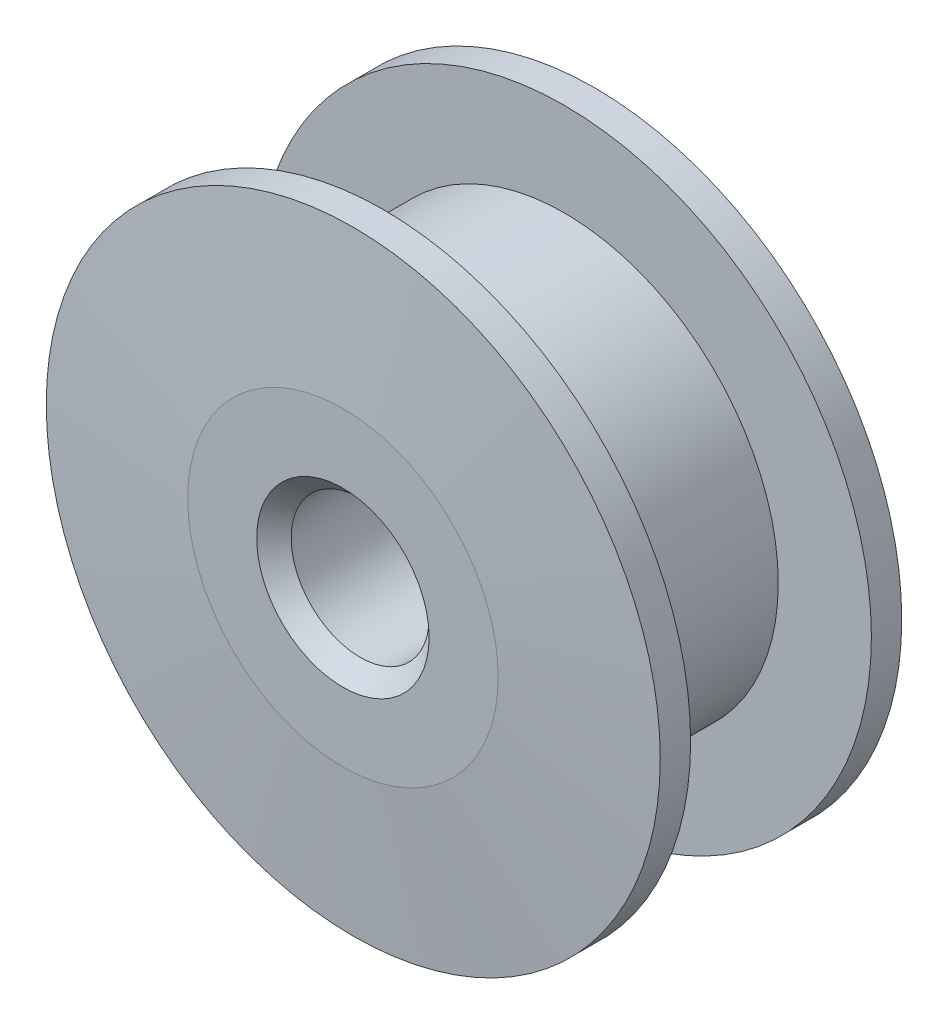
ISO-10303-21;
HEADER;
FILE_DESCRIPTION(('STEP AP214'),'2;1');
FILE_NAME('part.step','',(''),(''),'','','');
FILE_SCHEMA(('AUTOMOTIVE_DESIGN { 1 0 10303 214 1 1 1 1 }'));
ENDSEC;
DATA;
#1=APPLICATION_CONTEXT('core data for automotive mechanical design processes');
#2=APPLICATION_PROTOCOL_DEFINITION('international standard','automotive_design',2000,#1);
#3=PRODUCT_CONTEXT('',#1,'mechanical');
#4=PRODUCT('Part','Part','',(#3));
#5=PRODUCT_RELATED_PRODUCT_CATEGORY('part','',(#4));
#6=PRODUCT_DEFINITION_FORMATION('','',#4);
#7=PRODUCT_DEFINITION_CONTEXT('part definition',#1,'design');
#8=PRODUCT_DEFINITION('design','',#6,#7);
#9=PRODUCT_DEFINITION_SHAPE('','',#8);
#10=(LENGTH_UNIT() NAMED_UNIT(*) SI_UNIT(.MILLI.,.METRE.));
#11=(NAMED_UNIT(*) PLANE_ANGLE_UNIT() SI_UNIT($,.RADIAN.));
#12=(NAMED_UNIT(*) SI_UNIT($,.STERADIAN.) SOLID_ANGLE_UNIT());
#13=UNCERTAINTY_MEASURE_WITH_UNIT(LENGTH_MEASURE(1.E-05),#10,'distance_accuracy_value','');
#14=(GEOMETRIC_REPRESENTATION_CONTEXT(3) GLOBAL_UNCERTAINTY_ASSIGNED_CONTEXT((#13)) GLOBAL_UNIT_ASSIGNED_CONTEXT((#10,
#11,#12)) REPRESENTATION_CONTEXT('',''));
#15=CARTESIAN_POINT('',(0.,0.,0.));
#16=DIRECTION('',(0.,0.,1.));
#17=DIRECTION('',(1.,0.,0.));
#18=AXIS2_PLACEMENT_3D('',#15,#16,#17);
#19=CARTESIAN_POINT('',(0.,0.,1.9));
#20=DIRECTION('',(0.,0.,-1.));
#21=DIRECTION('',(-1.,0.,0.));
#22=AXIS2_PLACEMENT_3D('',#19,#20,#21);
#23=CYLINDRICAL_SURFACE('',#22,4.45);
#24=CARTESIAN_POINT('',(0.,0.,-1.75));
#25=DIRECTION('',(0.,0.,1.));
#26=DIRECTION('',(1.,0.,0.));
#27=AXIS2_PLACEMENT_3D('',#24,#25,#26);
#28=CIRCLE('',#27,4.45);
#29=CARTESIAN_POINT('',(-4.45,0.,-1.75));
#30=VERTEX_POINT('',#29);
#31=EDGE_CURVE('E47',#30,#30,#28,.T.);
#32=CARTESIAN_POINT('',(0.,0.,-1.31));
#33=DIRECTION('',(0.,0.,1.));
#34=DIRECTION('',(1.,0.,0.));
#35=AXIS2_PLACEMENT_3D('',#32,#33,#34);
#36=CIRCLE('',#35,4.45);
#37=CARTESIAN_POINT('',(-4.45,0.,-1.31));
#38=VERTEX_POINT('',#37);
#39=EDGE_CURVE('E64',#38,#38,#36,.T.);
#40=CARTESIAN_POINT('',(-4.45,0.,-1.75));
#41=CARTESIAN_POINT('',(-4.45,0.,-1.74541666666667));
#42=CARTESIAN_POINT('',(-4.45,0.,-1.74083333333333));
#43=CARTESIAN_POINT('',(-4.45,0.,-1.73166666666667));
#44=CARTESIAN_POINT('',(-4.45,0.,-1.72708333333333));
#45=CARTESIAN_POINT('',(-4.45,0.,-1.71791666666667));
#46=CARTESIAN_POINT('',(-4.45,0.,-1.71333333333333));
#47=CARTESIAN_POINT('',(-4.45,0.,-1.70416666666667));
#48=CARTESIAN_POINT('',(-4.45,0.,-1.69958333333333));
#49=CARTESIAN_POINT('',(-4.45,0.,-1.69041666666667));
#50=CARTESIAN_POINT('',(-4.45,0.,-1.68583333333333));
#51=CARTESIAN_POINT('',(-4.45,0.,-1.67666666666667));
#52=CARTESIAN_POINT('',(-4.45,0.,-1.67208333333333));
#53=CARTESIAN_POINT('',(-4.45,0.,-1.66291666666667));
#54=CARTESIAN_POINT('',(-4.45,0.,-1.65833333333333));
#55=CARTESIAN_POINT('',(-4.45,0.,-1.64916666666667));
#56=CARTESIAN_POINT('',(-4.45,0.,-1.64458333333333));
#57=CARTESIAN_POINT('',(-4.45,0.,-1.63541666666667));
#58=CARTESIAN_POINT('',(-4.45,0.,-1.63083333333333));
#59=CARTESIAN_POINT('',(-4.45,0.,-1.62166666666667));
#60=CARTESIAN_POINT('',(-4.45,0.,-1.61708333333333));
#61=CARTESIAN_POINT('',(-4.45,0.,-1.60791666666667));
#62=CARTESIAN_POINT('',(-4.45,0.,-1.60333333333333));
#63=CARTESIAN_POINT('',(-4.45,0.,-1.59416666666667));
#64=CARTESIAN_POINT('',(-4.45,0.,-1.58958333333333));
#65=CARTESIAN_POINT('',(-4.45,0.,-1.58041666666667));
#66=CARTESIAN_POINT('',(-4.45,0.,-1.57583333333333));
#67=CARTESIAN_POINT('',(-4.45,0.,-1.56666666666667));
#68=CARTESIAN_POINT('',(-4.45,0.,-1.56208333333333));
#69=CARTESIAN_POINT('',(-4.45,0.,-1.55291666666667));
#70=CARTESIAN_POINT('',(-4.45,0.,-1.54833333333333));
#71=CARTESIAN_POINT('',(-4.45,0.,-1.53916666666667));
#72=CARTESIAN_POINT('',(-4.45,0.,-1.53458333333333));
#73=CARTESIAN_POINT('',(-4.45,0.,-1.52541666666667));
#74=CARTESIAN_POINT('',(-4.45,0.,-1.52083333333333));
#75=CARTESIAN_POINT('',(-4.45,0.,-1.51166666666667));
#76=CARTESIAN_POINT('',(-4.45,0.,-1.50708333333333));
#77=CARTESIAN_POINT('',(-4.45,0.,-1.49791666666667));
#78=CARTESIAN_POINT('',(-4.45,0.,-1.49333333333333));
#79=CARTESIAN_POINT('',(-4.45,0.,-1.48416666666667));
#80=CARTESIAN_POINT('',(-4.45,0.,-1.47958333333333));
#81=CARTESIAN_POINT('',(-4.45,0.,-1.47041666666667));
#82=CARTESIAN_POINT('',(-4.45,0.,-1.46583333333333));
#83=CARTESIAN_POINT('',(-4.45,0.,-1.45666666666667));
#84=CARTESIAN_POINT('',(-4.45,0.,-1.45208333333333));
#85=CARTESIAN_POINT('',(-4.45,0.,-1.44291666666667));
#86=CARTESIAN_POINT('',(-4.45,0.,-1.43833333333333));
#87=CARTESIAN_POINT('',(-4.45,0.,-1.42916666666667));
#88=CARTESIAN_POINT('',(-4.45,0.,-1.42458333333333));
#89=CARTESIAN_POINT('',(-4.45,0.,-1.41541666666667));
#90=CARTESIAN_POINT('',(-4.45,0.,-1.41083333333333));
#91=CARTESIAN_POINT('',(-4.45,0.,-1.40166666666667));
#92=CARTESIAN_POINT('',(-4.45,0.,-1.39708333333333));
#93=CARTESIAN_POINT('',(-4.45,0.,-1.38791666666667));
#94=CARTESIAN_POINT('',(-4.45,0.,-1.38333333333333));
#95=CARTESIAN_POINT('',(-4.45,0.,-1.37416666666667));
#96=CARTESIAN_POINT('',(-4.45,0.,-1.36958333333333));
#97=CARTESIAN_POINT('',(-4.45,0.,-1.36041666666667));
#98=CARTESIAN_POINT('',(-4.45,0.,-1.35583333333333));
#99=CARTESIAN_POINT('',(-4.45,0.,-1.34666666666667));
#100=CARTESIAN_POINT('',(-4.45,0.,-1.34208333333333));
#101=CARTESIAN_POINT('',(-4.45,0.,-1.33291666666667));
#102=CARTESIAN_POINT('',(-4.45,0.,-1.32833333333333));
#103=CARTESIAN_POINT('',(-4.45,0.,-1.31916666666667));
#104=CARTESIAN_POINT('',(-4.45,0.,-1.31458333333333));
#105=CARTESIAN_POINT('',(-4.45,0.,-1.31));
#106=B_SPLINE_CURVE_WITH_KNOTS('',3,(#40,#41,#42,#43,#44,#45,#46,#47,#48,#49,#50,#51,#52,#53,
#54,#55,#56,#57,#58,#59,#60,#61,#62,#63,#64,#65,#66,#67,#68,#69,#70,#71,#72,#73,#74,#75,#76,#77,
#78,#79,#80,#81,#82,#83,#84,#85,#86,#87,#88,#89,#90,#91,#92,#93,#94,#95,#96,#97,#98,#99,#100,
#101,#102,#103,#104,#105),.UNSPECIFIED.,.F.,.F.,(4,2,2,2,2,2,2,2,2,2,2,2,2,2,2,2,2,2,2,2,2,2,2,
2,2,2,2,2,2,2,2,2,4),(0.,0.0137499999999999,0.0275000000000002,0.0412500000000001,
0.0549999999999999,0.0687500000000002,0.0825000000000001,0.09625,0.11,0.12375,0.1375,0.15125,
0.165,0.17875,0.1925,0.20625,0.22,0.23375,0.2475,0.26125,0.275,0.28875,0.3025,0.31625,0.33,
0.34375,0.3575,0.37125,0.385,0.39875,0.4125,0.42625,0.44),.UNSPECIFIED.);
#107=EDGE_CURVE('BSEAM32',#30,#38,#106,.T.);
#108=ORIENTED_EDGE('',*,*,#31,.T.);
#109=ORIENTED_EDGE('',*,*,#39,.F.);
#110=ORIENTED_EDGE('',*,*,#107,.T.);
#111=ORIENTED_EDGE('',*,*,#107,.F.);
#112=EDGE_LOOP('',(#108,#110,#109,#111));
#113=FACE_BOUND('',#112,.T.);
#114=ADVANCED_FACE('F32',(#113),#23,.T.);
#115=CARTESIAN_POINT('',(0.,0.,-1.9));
#116=DIRECTION('',(0.,0.,1.));
#117=DIRECTION('',(1.,0.,0.));
#118=AXIS2_PLACEMENT_3D('',#115,#116,#117);
#119=PLANE('',#118);
#120=CARTESIAN_POINT('',(0.,0.,-1.9));
#121=DIRECTION('',(0.,0.,1.));
#122=DIRECTION('',(1.,0.,0.));
#123=AXIS2_PLACEMENT_3D('',#120,#121,#122);
#124=CIRCLE('',#123,2.44999999999991);
#125=CARTESIAN_POINT('',(2.44999999999991,0.,-1.9));
#126=VERTEX_POINT('',#125);
#127=EDGE_CURVE('E43',#126,#126,#124,.F.);
#128=ORIENTED_EDGE('',*,*,#127,.T.);
#129=EDGE_LOOP('',(#128));
#130=FACE_BOUND('',#129,.T.);
#131=CARTESIAN_POINT('',(0.,0.,-1.9));
#132=DIRECTION('',(0.,0.,1.));
#133=DIRECTION('',(1.,0.,0.));
#134=AXIS2_PLACEMENT_3D('',#131,#132,#133);
#135=CIRCLE('',#134,1.25);
#136=CARTESIAN_POINT('',(1.25,0.,-1.9));
#137=VERTEX_POINT('',#136);
#138=EDGE_CURVE('E55',#137,#137,#135,.T.);
#139=ORIENTED_EDGE('',*,*,#138,.T.);
#140=EDGE_LOOP('',(#139));
#141=FACE_BOUND('',#140,.T.);
#142=ADVANCED_FACE('F84',(#130,#141),#119,.F.);
#143=CARTESIAN_POINT('',(0.,0.,-1.31));
#144=DIRECTION('',(0.,0.,1.));
#145=DIRECTION('',(1.,0.,0.));
#146=AXIS2_PLACEMENT_3D('',#143,#144,#145);
#147=PLANE('',#146);
#148=CARTESIAN_POINT('',(0.,0.,-1.31));
#149=DIRECTION('',(0.,0.,1.));
#150=DIRECTION('',(1.,0.,0.));
#151=AXIS2_PLACEMENT_3D('',#148,#149,#150);
#152=CIRCLE('',#151,3.1);
#153=CARTESIAN_POINT('',(3.1,0.,-1.31));
#154=VERTEX_POINT('',#153);
#155=EDGE_CURVE('E68',#154,#154,#152,.T.);
#156=ORIENTED_EDGE('',*,*,#155,.F.);
#157=EDGE_LOOP('',(#156));
#158=FACE_BOUND('',#157,.T.);
#159=ORIENTED_EDGE('',*,*,#39,.T.);
#160=EDGE_LOOP('',(#159));
#161=FACE_BOUND('',#160,.T.);
#162=ADVANCED_FACE('F80',(#158,#161),#147,.T.);
#163=CARTESIAN_POINT('',(0.,0.,1.31));
#164=DIRECTION('',(0.,0.,1.));
#165=DIRECTION('',(1.,0.,0.));
#166=AXIS2_PLACEMENT_3D('',#163,#164,#165);
#167=PLANE('',#166);
#168=CARTESIAN_POINT('',(0.,0.,1.31));
#169=DIRECTION('',(0.,0.,1.));
#170=DIRECTION('',(1.,0.,0.));
#171=AXIS2_PLACEMENT_3D('',#168,#169,#170);
#172=CIRCLE('',#171,3.1);
#173=CARTESIAN_POINT('',(3.1,0.,1.31));
#174=VERTEX_POINT('',#173);
#175=EDGE_CURVE('E71',#174,#174,#172,.T.);
#176=ORIENTED_EDGE('',*,*,#175,.T.);
#177=EDGE_LOOP('',(#176));
#178=FACE_BOUND('',#177,.T.);
#179=CARTESIAN_POINT('',(0.,0.,1.31));
#180=DIRECTION('',(0.,0.,1.));
#181=DIRECTION('',(1.,0.,0.));
#182=AXIS2_PLACEMENT_3D('',#179,#180,#181);
#183=CIRCLE('',#182,4.45);
#184=CARTESIAN_POINT('',(-4.45,0.,1.31));
#185=VERTEX_POINT('',#184);
#186=EDGE_CURVE('E65',#185,#185,#183,.T.);
#187=ORIENTED_EDGE('',*,*,#186,.F.);
#188=EDGE_LOOP('',(#187));
#189=FACE_BOUND('',#188,.T.);
#190=ADVANCED_FACE('F83',(#178,#189),#167,.F.);
#191=CARTESIAN_POINT('',(0.,0.,-1.31));
#192=DIRECTION('',(0.,0.,1.));
#193=DIRECTION('',(1.,0.,0.));
#194=AXIS2_PLACEMENT_3D('',#191,#192,#193);
#195=CYLINDRICAL_SURFACE('',#194,3.1);
#196=ORIENTED_EDGE('',*,*,#155,.T.);
#197=EDGE_LOOP('',(#196));
#198=FACE_BOUND('',#197,.T.);
#199=ORIENTED_EDGE('',*,*,#175,.F.);
#200=EDGE_LOOP('',(#199));
#201=FACE_BOUND('',#200,.T.);
#202=ADVANCED_FACE('F77',(#198,#201),#195,.T.);
#203=CARTESIAN_POINT('',(0.,0.,1.9));
#204=DIRECTION('',(0.,0.,1.));
#205=DIRECTION('',(1.,0.,0.));
#206=AXIS2_PLACEMENT_3D('',#203,#204,#205);
#207=PLANE('',#206);
#208=CARTESIAN_POINT('',(0.,0.,1.9));
#209=DIRECTION('',(0.,0.,1.));
#210=DIRECTION('',(1.,0.,0.));
#211=AXIS2_PLACEMENT_3D('',#208,#209,#210);
#212=CIRCLE('',#211,2.24999999999989);
#213=CARTESIAN_POINT('',(2.24999999999989,0.,1.9));
#214=VERTEX_POINT('',#213);
#215=EDGE_CURVE('E39',#214,#214,#212,.T.);
#216=ORIENTED_EDGE('',*,*,#215,.T.);
#217=EDGE_LOOP('',(#216));
#218=FACE_BOUND('',#217,.T.);
#219=CARTESIAN_POINT('',(0.,0.,1.9));
#220=DIRECTION('',(0.,0.,1.));
#221=DIRECTION('',(1.,0.,0.));
#222=AXIS2_PLACEMENT_3D('',#219,#220,#221);
#223=CIRCLE('',#222,1.25);
#224=CARTESIAN_POINT('',(1.25,0.,1.9));
#225=VERTEX_POINT('',#224);
#226=EDGE_CURVE('E52',#225,#225,#223,.F.);
#227=ORIENTED_EDGE('',*,*,#226,.T.);
#228=EDGE_LOOP('',(#227));
#229=FACE_BOUND('',#228,.T.);
#230=ADVANCED_FACE('F100',(#218,#229),#207,.T.);
#231=CARTESIAN_POINT('',(0.,0.,1.75));
#232=DIRECTION('',(0.,0.,1.));
#233=DIRECTION('',(1.,0.,0.));
#234=AXIS2_PLACEMENT_3D('',#231,#232,#233);
#235=CIRCLE('',#234,4.45);
#236=CARTESIAN_POINT('',(-4.45,0.,1.75));
#237=VERTEX_POINT('',#236);
#238=EDGE_CURVE('E10',#237,#237,#235,.F.);
#239=CARTESIAN_POINT('',(-4.45,0.,1.75));
#240=CARTESIAN_POINT('',(-4.45,0.,1.74541666666667));
#241=CARTESIAN_POINT('',(-4.45,0.,1.74083333333333));
#242=CARTESIAN_POINT('',(-4.45,0.,1.73166666666667));
#243=CARTESIAN_POINT('',(-4.45,0.,1.72708333333333));
#244=CARTESIAN_POINT('',(-4.45,0.,1.71791666666667));
#245=CARTESIAN_POINT('',(-4.45,0.,1.71333333333333));
#246=CARTESIAN_POINT('',(-4.45,0.,1.70416666666667));
#247=CARTESIAN_POINT('',(-4.45,0.,1.69958333333333));
#248=CARTESIAN_POINT('',(-4.45,0.,1.69041666666667));
#249=CARTESIAN_POINT('',(-4.45,0.,1.68583333333333));
#250=CARTESIAN_POINT('',(-4.45,0.,1.67666666666667));
#251=CARTESIAN_POINT('',(-4.45,0.,1.67208333333333));
#252=CARTESIAN_POINT('',(-4.45,0.,1.66291666666667));
#253=CARTESIAN_POINT('',(-4.45,0.,1.65833333333333));
#254=CARTESIAN_POINT('',(-4.45,0.,1.64916666666667));
#255=CARTESIAN_POINT('',(-4.45,0.,1.64458333333333));
#256=CARTESIAN_POINT('',(-4.45,0.,1.63541666666667));
#257=CARTESIAN_POINT('',(-4.45,0.,1.63083333333333));
#258=CARTESIAN_POINT('',(-4.45,0.,1.62166666666667));
#259=CARTESIAN_POINT('',(-4.45,0.,1.61708333333333));
#260=CARTESIAN_POINT('',(-4.45,0.,1.60791666666667));
#261=CARTESIAN_POINT('',(-4.45,0.,1.60333333333333));
#262=CARTESIAN_POINT('',(-4.45,0.,1.59416666666667));
#263=CARTESIAN_POINT('',(-4.45,0.,1.58958333333333));
#264=CARTESIAN_POINT('',(-4.45,0.,1.58041666666667));
#265=CARTESIAN_POINT('',(-4.45,0.,1.57583333333333));
#266=CARTESIAN_POINT('',(-4.45,0.,1.56666666666667));
#267=CARTESIAN_POINT('',(-4.45,0.,1.56208333333333));
#268=CARTESIAN_POINT('',(-4.45,0.,1.55291666666667));
#269=CARTESIAN_POINT('',(-4.45,0.,1.54833333333333));
#270=CARTESIAN_POINT('',(-4.45,0.,1.53916666666667));
#271=CARTESIAN_POINT('',(-4.45,0.,1.53458333333333));
#272=CARTESIAN_POINT('',(-4.45,0.,1.52541666666667));
#273=CARTESIAN_POINT('',(-4.45,0.,1.52083333333333));
#274=CARTESIAN_POINT('',(-4.45,0.,1.51166666666667));
#275=CARTESIAN_POINT('',(-4.45,0.,1.50708333333333));
#276=CARTESIAN_POINT('',(-4.45,0.,1.49791666666667));
#277=CARTESIAN_POINT('',(-4.45,0.,1.49333333333333));
#278=CARTESIAN_POINT('',(-4.45,0.,1.48416666666667));
#279=CARTESIAN_POINT('',(-4.45,0.,1.47958333333333));
#280=CARTESIAN_POINT('',(-4.45,0.,1.47041666666667));
#281=CARTESIAN_POINT('',(-4.45,0.,1.46583333333333));
#282=CARTESIAN_POINT('',(-4.45,0.,1.45666666666667));
#283=CARTESIAN_POINT('',(-4.45,0.,1.45208333333333));
#284=CARTESIAN_POINT('',(-4.45,0.,1.44291666666667));
#285=CARTESIAN_POINT('',(-4.45,0.,1.43833333333333));
#286=CARTESIAN_POINT('',(-4.45,0.,1.42916666666667));
#287=CARTESIAN_POINT('',(-4.45,0.,1.42458333333333));
#288=CARTESIAN_POINT('',(-4.45,0.,1.41541666666667));
#289=CARTESIAN_POINT('',(-4.45,0.,1.41083333333333));
#290=CARTESIAN_POINT('',(-4.45,0.,1.40166666666667));
#291=CARTESIAN_POINT('',(-4.45,0.,1.39708333333333));
#292=CARTESIAN_POINT('',(-4.45,0.,1.38791666666667));
#293=CARTESIAN_POINT('',(-4.45,0.,1.38333333333333));
#294=CARTESIAN_POINT('',(-4.45,0.,1.37416666666667));
#295=CARTESIAN_POINT('',(-4.45,0.,1.36958333333333));
#296=CARTESIAN_POINT('',(-4.45,0.,1.36041666666667));
#297=CARTESIAN_POINT('',(-4.45,0.,1.35583333333333));
#298=CARTESIAN_POINT('',(-4.45,0.,1.34666666666667));
#299=CARTESIAN_POINT('',(-4.45,0.,1.34208333333333));
#300=CARTESIAN_POINT('',(-4.45,0.,1.33291666666667));
#301=CARTESIAN_POINT('',(-4.45,0.,1.32833333333333));
#302=CARTESIAN_POINT('',(-4.45,0.,1.31916666666667));
#303=CARTESIAN_POINT('',(-4.45,0.,1.31458333333333));
#304=CARTESIAN_POINT('',(-4.45,0.,1.31));
#305=B_SPLINE_CURVE_WITH_KNOTS('',3,(#239,#240,#241,#242,#243,#244,#245,#246,#247,#248,#249,
#250,#251,#252,#253,#254,#255,#256,#257,#258,#259,#260,#261,#262,#263,#264,#265,#266,#267,#268,
#269,#270,#271,#272,#273,#274,#275,#276,#277,#278,#279,#280,#281,#282,#283,#284,#285,#286,#287,
#288,#289,#290,#291,#292,#293,#294,#295,#296,#297,#298,#299,#300,#301,#302,#303,#304),
.UNSPECIFIED.,.F.,.F.,(4,2,2,2,2,2,2,2,2,2,2,2,2,2,2,2,2,2,2,2,2,2,2,2,2,2,2,2,2,2,2,2,4),(0.,
0.0137499999999999,0.0275,0.0412499999999998,0.0549999999999999,0.06875,0.0824999999999999,
0.0962499999999998,0.11,0.12375,0.1375,0.15125,0.165,0.17875,0.1925,0.20625,0.22,0.23375,0.2475,
0.26125,0.275,0.28875,0.3025,0.31625,0.33,0.34375,0.3575,0.37125,0.385,0.39875,0.4125,0.42625,
0.44),.UNSPECIFIED.);
#306=EDGE_CURVE('BSEAM91',#237,#185,#305,.T.);
#307=ORIENTED_EDGE('',*,*,#238,.T.);
#308=ORIENTED_EDGE('',*,*,#186,.T.);
#309=ORIENTED_EDGE('',*,*,#306,.T.);
#310=ORIENTED_EDGE('',*,*,#306,.F.);
#311=EDGE_LOOP('',(#307,#309,#308,#310));
#312=FACE_BOUND('',#311,.T.);
#313=ADVANCED_FACE('F91',(#312),#23,.T.);
#314=CARTESIAN_POINT('',(0.,0.,-4.72842712474619));
#315=DIRECTION('',(0.,0.,1.));
#316=DIRECTION('',(1.,0.,0.));
#317=AXIS2_PLACEMENT_3D('',#314,#315,#316);
#318=CYLINDRICAL_SURFACE('',#317,1.);
#319=CARTESIAN_POINT('',(0.,0.,-1.65));
#320=DIRECTION('',(0.,0.,1.));
#321=DIRECTION('',(1.,0.,0.));
#322=AXIS2_PLACEMENT_3D('',#319,#320,#321);
#323=CIRCLE('',#322,1.);
#324=CARTESIAN_POINT('',(1.,0.,-1.65));
#325=VERTEX_POINT('',#324);
#326=EDGE_CURVE('E58',#325,#325,#323,.F.);
#327=ORIENTED_EDGE('',*,*,#326,.T.);
#328=EDGE_LOOP('',(#327));
#329=FACE_BOUND('',#328,.T.);
#330=CARTESIAN_POINT('',(0.,0.,1.65));
#331=DIRECTION('',(0.,0.,1.));
#332=DIRECTION('',(1.,0.,0.));
#333=AXIS2_PLACEMENT_3D('',#330,#331,#332);
#334=CIRCLE('',#333,1.);
#335=CARTESIAN_POINT('',(1.,0.,1.65));
#336=VERTEX_POINT('',#335);
#337=EDGE_CURVE('E61',#336,#336,#334,.T.);
#338=ORIENTED_EDGE('',*,*,#337,.T.);
#339=EDGE_LOOP('',(#338));
#340=FACE_BOUND('',#339,.T.);
#341=ADVANCED_FACE('F99',(#329,#340),#318,.F.);
#342=CARTESIAN_POINT('',(0.,0.,-1.65));
#343=DIRECTION('',(0.,0.,-1.));
#344=DIRECTION('',(-1.,0.,0.));
#345=AXIS2_PLACEMENT_3D('',#342,#343,#344);
#346=CONICAL_SURFACE('',#345,1.,0.785398163397448);
#347=ORIENTED_EDGE('',*,*,#138,.F.);
#348=EDGE_LOOP('',(#347));
#349=FACE_BOUND('',#348,.T.);
#350=ORIENTED_EDGE('',*,*,#326,.F.);
#351=EDGE_LOOP('',(#350));
#352=FACE_BOUND('',#351,.T.);
#353=ADVANCED_FACE('F105',(#349,#352),#346,.F.);
#354=CARTESIAN_POINT('',(0.,0.,1.65));
#355=DIRECTION('',(0.,0.,1.));
#356=DIRECTION('',(1.,0.,0.));
#357=AXIS2_PLACEMENT_3D('',#354,#355,#356);
#358=CONICAL_SURFACE('',#357,1.,0.785398163397448);
#359=ORIENTED_EDGE('',*,*,#226,.F.);
#360=EDGE_LOOP('',(#359));
#361=FACE_BOUND('',#360,.T.);
#362=ORIENTED_EDGE('',*,*,#337,.F.);
#363=EDGE_LOOP('',(#362));
#364=FACE_BOUND('',#363,.T.);
#365=ADVANCED_FACE('F152',(#361,#364),#358,.F.);
#366=CARTESIAN_POINT('',(0.,0.,-1.75));
#367=DIRECTION('',(0.,0.,1.));
#368=DIRECTION('',(1.,0.,0.));
#369=AXIS2_PLACEMENT_3D('',#366,#367,#368);
#370=CONICAL_SURFACE('',#369,4.45,1.49593647908413);
#371=ORIENTED_EDGE('',*,*,#127,.F.);
#372=EDGE_LOOP('',(#371));
#373=FACE_BOUND('',#372,.T.);
#374=ORIENTED_EDGE('',*,*,#31,.F.);
#375=EDGE_LOOP('',(#374));
#376=FACE_BOUND('',#375,.T.);
#377=ADVANCED_FACE('F134',(#373,#376),#370,.T.);
#378=CARTESIAN_POINT('',(0.,0.,1.9));
#379=DIRECTION('',(0.,0.,-1.));
#380=DIRECTION('',(-1.,0.,0.));
#381=AXIS2_PLACEMENT_3D('',#378,#379,#380);
#382=CONICAL_SURFACE('',#381,2.24999999999989,1.5027198685369);
#383=ORIENTED_EDGE('',*,*,#238,.F.);
#384=EDGE_LOOP('',(#383));
#385=FACE_BOUND('',#384,.T.);
#386=ORIENTED_EDGE('',*,*,#215,.F.);
#387=EDGE_LOOP('',(#386));
#388=FACE_BOUND('',#387,.T.);
#389=ADVANCED_FACE('F34',(#385,#388),#382,.T.);
#390=CLOSED_SHELL('',(#114,#142,#162,#190,#202,#230,#313,#341,#353,#365,#377,#389));
#391=MANIFOLD_SOLID_BREP('B2',#390);
#392=ADVANCED_BREP_SHAPE_REPRESENTATION('',(#18,#391),#14);
#393=SHAPE_DEFINITION_REPRESENTATION(#9,#392);
ENDSEC;
END-ISO-10303-21;
